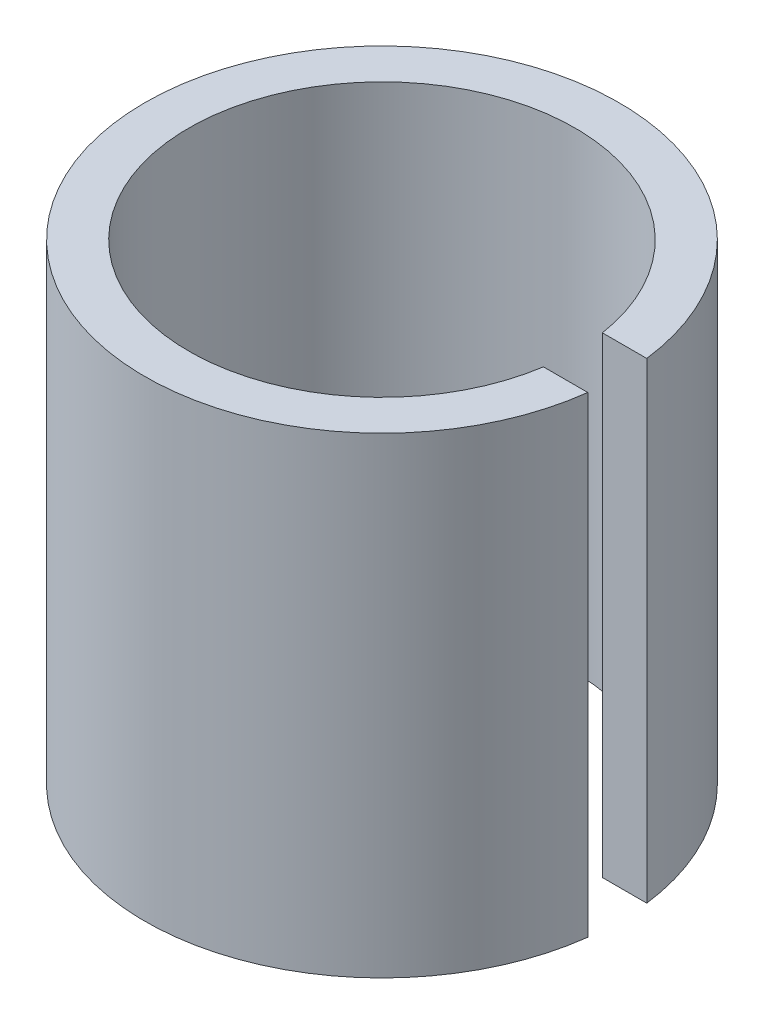
ISO-10303-21;
HEADER;
FILE_DESCRIPTION(('STEP AP214'),'2;1');
FILE_NAME('part.step','',(''),(''),'','','');
FILE_SCHEMA(('AUTOMOTIVE_DESIGN { 1 0 10303 214 1 1 1 1 }'));
ENDSEC;
DATA;
#1=APPLICATION_CONTEXT('core data for automotive mechanical design processes');
#2=APPLICATION_PROTOCOL_DEFINITION('international standard','automotive_design',2000,#1);
#3=PRODUCT_CONTEXT('',#1,'mechanical');
#4=PRODUCT('Part','Part','',(#3));
#5=PRODUCT_RELATED_PRODUCT_CATEGORY('part','',(#4));
#6=PRODUCT_DEFINITION_FORMATION('','',#4);
#7=PRODUCT_DEFINITION_CONTEXT('part definition',#1,'design');
#8=PRODUCT_DEFINITION('design','',#6,#7);
#9=PRODUCT_DEFINITION_SHAPE('','',#8);
#10=(LENGTH_UNIT() NAMED_UNIT(*) SI_UNIT(.MILLI.,.METRE.));
#11=(NAMED_UNIT(*) PLANE_ANGLE_UNIT() SI_UNIT($,.RADIAN.));
#12=(NAMED_UNIT(*) SI_UNIT($,.STERADIAN.) SOLID_ANGLE_UNIT());
#13=UNCERTAINTY_MEASURE_WITH_UNIT(LENGTH_MEASURE(1.E-05),#10,'distance_accuracy_value','');
#14=(GEOMETRIC_REPRESENTATION_CONTEXT(3) GLOBAL_UNCERTAINTY_ASSIGNED_CONTEXT((#13)) GLOBAL_UNIT_ASSIGNED_CONTEXT((#10,
#11,#12)) REPRESENTATION_CONTEXT('',''));
#15=CARTESIAN_POINT('',(0.,0.,0.));
#16=DIRECTION('',(0.,0.,1.));
#17=DIRECTION('',(1.,0.,0.));
#18=AXIS2_PLACEMENT_3D('',#15,#16,#17);
#19=CARTESIAN_POINT('',(0.,12.,0.));
#20=DIRECTION('',(0.,-1.,0.));
#21=DIRECTION('',(0.,0.,-1.));
#22=AXIS2_PLACEMENT_3D('',#19,#20,#21);
#23=CYLINDRICAL_SURFACE('',#22,4.915);
#24=CARTESIAN_POINT('',(0.,0.,0.));
#25=DIRECTION('',(0.,-1.,0.));
#26=DIRECTION('',(0.,0.,1.));
#27=AXIS2_PLACEMENT_3D('',#24,#25,#26);
#28=CIRCLE('',#27,4.915);
#29=CARTESIAN_POINT('',(4.85744016947198,0.,0.75));
#30=VERTEX_POINT('',#29);
#31=CARTESIAN_POINT('',(4.85744016947198,0.,-0.75));
#32=VERTEX_POINT('',#31);
#33=EDGE_CURVE('E96',#30,#32,#28,.T.);
#34=ORIENTED_EDGE('',*,*,#33,.T.);
#35=DIRECTION('',(0.,-1.,0.));
#36=VECTOR('',#35,1.);
#37=CARTESIAN_POINT('',(4.85744016947198,12.,-0.75));
#38=LINE('',#37,#36);
#39=CARTESIAN_POINT('',(4.85744016947198,12.,-0.75));
#40=VERTEX_POINT('',#39);
#41=EDGE_CURVE('E11',#40,#32,#38,.T.);
#42=ORIENTED_EDGE('',*,*,#41,.F.);
#43=CARTESIAN_POINT('',(0.,12.,0.));
#44=DIRECTION('',(0.,-1.,0.));
#45=DIRECTION('',(0.,0.,1.));
#46=AXIS2_PLACEMENT_3D('',#43,#44,#45);
#47=CIRCLE('',#46,4.915);
#48=CARTESIAN_POINT('',(4.85744016947198,12.,0.75));
#49=VERTEX_POINT('',#48);
#50=EDGE_CURVE('E84',#49,#40,#47,.T.);
#51=ORIENTED_EDGE('',*,*,#50,.F.);
#52=DIRECTION('',(0.,-1.,0.));
#53=VECTOR('',#52,1.);
#54=CARTESIAN_POINT('',(4.85744016947198,12.,0.75));
#55=LINE('',#54,#53);
#56=EDGE_CURVE('E92',#49,#30,#55,.T.);
#57=ORIENTED_EDGE('',*,*,#56,.T.);
#58=EDGE_LOOP('',(#34,#42,#51,#57));
#59=FACE_BOUND('',#58,.T.);
#60=ADVANCED_FACE('F33',(#59),#23,.F.);
#61=CARTESIAN_POINT('',(4.85744016947198,12.,-0.75));
#62=DIRECTION('',(0.,0.,-1.));
#63=DIRECTION('',(-1.,0.,0.));
#64=AXIS2_PLACEMENT_3D('',#61,#62,#63);
#65=PLANE('',#64);
#66=DIRECTION('',(1.,0.,0.));
#67=VECTOR('',#66,1.);
#68=CARTESIAN_POINT('',(4.85744016947198,0.,-0.75));
#69=LINE('',#68,#67);
#70=CARTESIAN_POINT('',(5.98569597039475,0.,-0.75));
#71=VERTEX_POINT('',#70);
#72=EDGE_CURVE('E88',#32,#71,#69,.T.);
#73=ORIENTED_EDGE('',*,*,#72,.T.);
#74=DIRECTION('',(0.,-1.,0.));
#75=VECTOR('',#74,1.);
#76=CARTESIAN_POINT('',(5.98569597039475,12.,-0.75));
#77=LINE('',#76,#75);
#78=CARTESIAN_POINT('',(5.98569597039475,12.,-0.75));
#79=VERTEX_POINT('',#78);
#80=EDGE_CURVE('E41',#79,#71,#77,.T.);
#81=ORIENTED_EDGE('',*,*,#80,.F.);
#82=DIRECTION('',(1.,0.,0.));
#83=VECTOR('',#82,1.);
#84=CARTESIAN_POINT('',(4.85744016947198,12.,-0.75));
#85=LINE('',#84,#83);
#86=EDGE_CURVE('E79',#40,#79,#85,.T.);
#87=ORIENTED_EDGE('',*,*,#86,.F.);
#88=ORIENTED_EDGE('',*,*,#41,.T.);
#89=EDGE_LOOP('',(#73,#81,#87,#88));
#90=FACE_BOUND('',#89,.T.);
#91=ADVANCED_FACE('F87',(#90),#65,.F.);
#92=CARTESIAN_POINT('',(0.,12.,0.));
#93=DIRECTION('',(0.,-1.,0.));
#94=DIRECTION('',(0.,0.,-1.));
#95=AXIS2_PLACEMENT_3D('',#92,#93,#94);
#96=CYLINDRICAL_SURFACE('',#95,6.0325);
#97=CARTESIAN_POINT('',(0.,0.,0.));
#98=DIRECTION('',(0.,1.,0.));
#99=DIRECTION('',(0.,0.,1.));
#100=AXIS2_PLACEMENT_3D('',#97,#98,#99);
#101=CIRCLE('',#100,6.0325);
#102=CARTESIAN_POINT('',(5.98569597039475,0.,0.75));
#103=VERTEX_POINT('',#102);
#104=EDGE_CURVE('E66',#71,#103,#101,.T.);
#105=ORIENTED_EDGE('',*,*,#104,.T.);
#106=DIRECTION('',(0.,-1.,0.));
#107=VECTOR('',#106,1.);
#108=CARTESIAN_POINT('',(5.98569597039475,12.,0.75));
#109=LINE('',#108,#107);
#110=CARTESIAN_POINT('',(5.98569597039475,12.,0.75));
#111=VERTEX_POINT('',#110);
#112=EDGE_CURVE('E89',#111,#103,#109,.T.);
#113=ORIENTED_EDGE('',*,*,#112,.F.);
#114=CARTESIAN_POINT('',(0.,12.,0.));
#115=DIRECTION('',(0.,1.,0.));
#116=DIRECTION('',(0.,0.,1.));
#117=AXIS2_PLACEMENT_3D('',#114,#115,#116);
#118=CIRCLE('',#117,6.0325);
#119=EDGE_CURVE('E82',#79,#111,#118,.T.);
#120=ORIENTED_EDGE('',*,*,#119,.F.);
#121=ORIENTED_EDGE('',*,*,#80,.T.);
#122=EDGE_LOOP('',(#105,#113,#120,#121));
#123=FACE_BOUND('',#122,.T.);
#124=ADVANCED_FACE('F90',(#123),#96,.T.);
#125=CARTESIAN_POINT('',(4.85744016947198,12.,0.75));
#126=DIRECTION('',(0.,0.,1.));
#127=DIRECTION('',(1.,0.,0.));
#128=AXIS2_PLACEMENT_3D('',#125,#126,#127);
#129=PLANE('',#128);
#130=DIRECTION('',(-1.,0.,0.));
#131=VECTOR('',#130,1.);
#132=CARTESIAN_POINT('',(4.85744016947198,0.,0.75));
#133=LINE('',#132,#131);
#134=EDGE_CURVE('E72',#103,#30,#133,.T.);
#135=ORIENTED_EDGE('',*,*,#134,.T.);
#136=ORIENTED_EDGE('',*,*,#56,.F.);
#137=DIRECTION('',(-1.,0.,0.));
#138=VECTOR('',#137,1.);
#139=CARTESIAN_POINT('',(4.85744016947198,12.,0.75));
#140=LINE('',#139,#138);
#141=EDGE_CURVE('E49',#111,#49,#140,.T.);
#142=ORIENTED_EDGE('',*,*,#141,.F.);
#143=ORIENTED_EDGE('',*,*,#112,.T.);
#144=EDGE_LOOP('',(#135,#136,#142,#143));
#145=FACE_BOUND('',#144,.T.);
#146=ADVANCED_FACE('F103',(#145),#129,.F.);
#147=CARTESIAN_POINT('',(0.,12.,0.));
#148=DIRECTION('',(0.,1.,0.));
#149=DIRECTION('',(0.,0.,1.));
#150=AXIS2_PLACEMENT_3D('',#147,#148,#149);
#151=PLANE('',#150);
#152=ORIENTED_EDGE('',*,*,#50,.T.);
#153=ORIENTED_EDGE('',*,*,#86,.T.);
#154=ORIENTED_EDGE('',*,*,#119,.T.);
#155=ORIENTED_EDGE('',*,*,#141,.T.);
#156=EDGE_LOOP('',(#152,#153,#154,#155));
#157=FACE_BOUND('',#156,.T.);
#158=ADVANCED_FACE('F80',(#157),#151,.T.);
#159=CARTESIAN_POINT('',(0.,0.,0.));
#160=DIRECTION('',(0.,1.,0.));
#161=DIRECTION('',(0.,0.,1.));
#162=AXIS2_PLACEMENT_3D('',#159,#160,#161);
#163=PLANE('',#162);
#164=ORIENTED_EDGE('',*,*,#33,.F.);
#165=ORIENTED_EDGE('',*,*,#134,.F.);
#166=ORIENTED_EDGE('',*,*,#104,.F.);
#167=ORIENTED_EDGE('',*,*,#72,.F.);
#168=EDGE_LOOP('',(#164,#165,#166,#167));
#169=FACE_BOUND('',#168,.T.);
#170=ADVANCED_FACE('F106',(#169),#163,.F.);
#171=CLOSED_SHELL('',(#60,#91,#124,#146,#158,#170));
#172=MANIFOLD_SOLID_BREP('B2',#171);
#173=ADVANCED_BREP_SHAPE_REPRESENTATION('',(#18,#172),#14);
#174=SHAPE_DEFINITION_REPRESENTATION(#9,#173);
ENDSEC;
END-ISO-10303-21;
